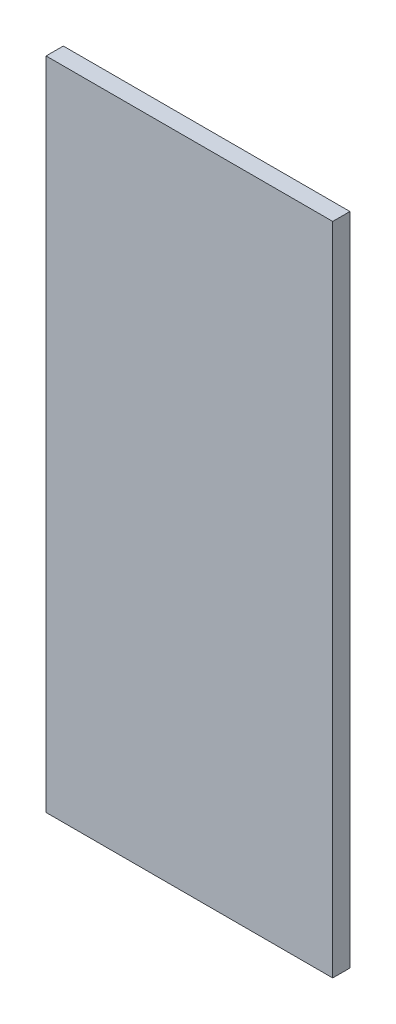
ISO-10303-21;
HEADER;
FILE_DESCRIPTION(('STEP AP214'),'2;1');
FILE_NAME('part.step','',(''),(''),'','','');
FILE_SCHEMA(('AUTOMOTIVE_DESIGN { 1 0 10303 214 1 1 1 1 }'));
ENDSEC;
DATA;
#1=APPLICATION_CONTEXT('core data for automotive mechanical design processes');
#2=APPLICATION_PROTOCOL_DEFINITION('international standard','automotive_design',2000,#1);
#3=PRODUCT_CONTEXT('',#1,'mechanical');
#4=PRODUCT('Part','Part','',(#3));
#5=PRODUCT_RELATED_PRODUCT_CATEGORY('part','',(#4));
#6=PRODUCT_DEFINITION_FORMATION('','',#4);
#7=PRODUCT_DEFINITION_CONTEXT('part definition',#1,'design');
#8=PRODUCT_DEFINITION('design','',#6,#7);
#9=PRODUCT_DEFINITION_SHAPE('','',#8);
#10=(LENGTH_UNIT() NAMED_UNIT(*) SI_UNIT(.MILLI.,.METRE.));
#11=(NAMED_UNIT(*) PLANE_ANGLE_UNIT() SI_UNIT($,.RADIAN.));
#12=(NAMED_UNIT(*) SI_UNIT($,.STERADIAN.) SOLID_ANGLE_UNIT());
#13=UNCERTAINTY_MEASURE_WITH_UNIT(LENGTH_MEASURE(1.E-05),#10,'distance_accuracy_value','');
#14=(GEOMETRIC_REPRESENTATION_CONTEXT(3) GLOBAL_UNCERTAINTY_ASSIGNED_CONTEXT((#13)) GLOBAL_UNIT_ASSIGNED_CONTEXT((#10,
#11,#12)) REPRESENTATION_CONTEXT('',''));
#15=CARTESIAN_POINT('',(0.,0.,0.));
#16=DIRECTION('',(0.,0.,1.));
#17=DIRECTION('',(1.,0.,0.));
#18=AXIS2_PLACEMENT_3D('',#15,#16,#17);
#19=CARTESIAN_POINT('',(-25.,-57.15,3.));
#20=DIRECTION('',(1.,0.,0.));
#21=DIRECTION('',(0.,0.,-1.));
#22=AXIS2_PLACEMENT_3D('',#19,#20,#21);
#23=PLANE('',#22);
#24=DIRECTION('',(0.,-1.,0.));
#25=VECTOR('',#24,1.);
#26=CARTESIAN_POINT('',(-25.,-57.15,0.));
#27=LINE('',#26,#25);
#28=CARTESIAN_POINT('',(-25.,57.15,0.));
#29=VERTEX_POINT('',#28);
#30=CARTESIAN_POINT('',(-25.,-57.15,0.));
#31=VERTEX_POINT('',#30);
#32=EDGE_CURVE('E96',#29,#31,#27,.T.);
#33=ORIENTED_EDGE('',*,*,#32,.T.);
#34=DIRECTION('',(0.,0.,-1.));
#35=VECTOR('',#34,1.);
#36=CARTESIAN_POINT('',(-25.,-57.15,3.));
#37=LINE('',#36,#35);
#38=CARTESIAN_POINT('',(-25.,-57.15,3.));
#39=VERTEX_POINT('',#38);
#40=EDGE_CURVE('E11',#39,#31,#37,.T.);
#41=ORIENTED_EDGE('',*,*,#40,.F.);
#42=DIRECTION('',(0.,-1.,0.));
#43=VECTOR('',#42,1.);
#44=CARTESIAN_POINT('',(-25.,-57.15,3.));
#45=LINE('',#44,#43);
#46=CARTESIAN_POINT('',(-25.,57.15,3.));
#47=VERTEX_POINT('',#46);
#48=EDGE_CURVE('E84',#47,#39,#45,.T.);
#49=ORIENTED_EDGE('',*,*,#48,.F.);
#50=DIRECTION('',(0.,0.,-1.));
#51=VECTOR('',#50,1.);
#52=CARTESIAN_POINT('',(-25.,57.15,3.));
#53=LINE('',#52,#51);
#54=EDGE_CURVE('E92',#47,#29,#53,.T.);
#55=ORIENTED_EDGE('',*,*,#54,.T.);
#56=EDGE_LOOP('',(#33,#41,#49,#55));
#57=FACE_BOUND('',#56,.T.);
#58=ADVANCED_FACE('F33',(#57),#23,.F.);
#59=CARTESIAN_POINT('',(25.,-57.15,3.));
#60=DIRECTION('',(0.,1.,0.));
#61=DIRECTION('',(0.,0.,1.));
#62=AXIS2_PLACEMENT_3D('',#59,#60,#61);
#63=PLANE('',#62);
#64=DIRECTION('',(1.,0.,0.));
#65=VECTOR('',#64,1.);
#66=CARTESIAN_POINT('',(25.,-57.15,0.));
#67=LINE('',#66,#65);
#68=CARTESIAN_POINT('',(25.,-57.15,0.));
#69=VERTEX_POINT('',#68);
#70=EDGE_CURVE('E88',#31,#69,#67,.T.);
#71=ORIENTED_EDGE('',*,*,#70,.T.);
#72=DIRECTION('',(0.,0.,-1.));
#73=VECTOR('',#72,1.);
#74=CARTESIAN_POINT('',(25.,-57.15,3.));
#75=LINE('',#74,#73);
#76=CARTESIAN_POINT('',(25.,-57.15,3.));
#77=VERTEX_POINT('',#76);
#78=EDGE_CURVE('E41',#77,#69,#75,.T.);
#79=ORIENTED_EDGE('',*,*,#78,.F.);
#80=DIRECTION('',(1.,0.,0.));
#81=VECTOR('',#80,1.);
#82=CARTESIAN_POINT('',(25.,-57.15,3.));
#83=LINE('',#82,#81);
#84=EDGE_CURVE('E79',#39,#77,#83,.T.);
#85=ORIENTED_EDGE('',*,*,#84,.F.);
#86=ORIENTED_EDGE('',*,*,#40,.T.);
#87=EDGE_LOOP('',(#71,#79,#85,#86));
#88=FACE_BOUND('',#87,.T.);
#89=ADVANCED_FACE('F87',(#88),#63,.F.);
#90=CARTESIAN_POINT('',(25.,-57.15,3.));
#91=DIRECTION('',(-1.,0.,0.));
#92=DIRECTION('',(0.,0.,1.));
#93=AXIS2_PLACEMENT_3D('',#90,#91,#92);
#94=PLANE('',#93);
#95=DIRECTION('',(0.,1.,0.));
#96=VECTOR('',#95,1.);
#97=CARTESIAN_POINT('',(25.,-57.15,0.));
#98=LINE('',#97,#96);
#99=CARTESIAN_POINT('',(25.,57.15,0.));
#100=VERTEX_POINT('',#99);
#101=EDGE_CURVE('E66',#69,#100,#98,.T.);
#102=ORIENTED_EDGE('',*,*,#101,.T.);
#103=DIRECTION('',(0.,0.,-1.));
#104=VECTOR('',#103,1.);
#105=CARTESIAN_POINT('',(25.,57.15,3.));
#106=LINE('',#105,#104);
#107=CARTESIAN_POINT('',(25.,57.15,3.));
#108=VERTEX_POINT('',#107);
#109=EDGE_CURVE('E89',#108,#100,#106,.T.);
#110=ORIENTED_EDGE('',*,*,#109,.F.);
#111=DIRECTION('',(0.,1.,0.));
#112=VECTOR('',#111,1.);
#113=CARTESIAN_POINT('',(25.,-57.15,3.));
#114=LINE('',#113,#112);
#115=EDGE_CURVE('E82',#77,#108,#114,.T.);
#116=ORIENTED_EDGE('',*,*,#115,.F.);
#117=ORIENTED_EDGE('',*,*,#78,.T.);
#118=EDGE_LOOP('',(#102,#110,#116,#117));
#119=FACE_BOUND('',#118,.T.);
#120=ADVANCED_FACE('F90',(#119),#94,.F.);
#121=CARTESIAN_POINT('',(25.,57.15,3.));
#122=DIRECTION('',(0.,-1.,0.));
#123=DIRECTION('',(1.,0.,0.));
#124=AXIS2_PLACEMENT_3D('',#121,#122,#123);
#125=PLANE('',#124);
#126=DIRECTION('',(-1.,0.,0.));
#127=VECTOR('',#126,1.);
#128=CARTESIAN_POINT('',(25.,57.15,0.));
#129=LINE('',#128,#127);
#130=EDGE_CURVE('E72',#100,#29,#129,.T.);
#131=ORIENTED_EDGE('',*,*,#130,.T.);
#132=ORIENTED_EDGE('',*,*,#54,.F.);
#133=DIRECTION('',(-1.,0.,0.));
#134=VECTOR('',#133,1.);
#135=CARTESIAN_POINT('',(25.,57.15,3.));
#136=LINE('',#135,#134);
#137=EDGE_CURVE('E49',#108,#47,#136,.T.);
#138=ORIENTED_EDGE('',*,*,#137,.F.);
#139=ORIENTED_EDGE('',*,*,#109,.T.);
#140=EDGE_LOOP('',(#131,#132,#138,#139));
#141=FACE_BOUND('',#140,.T.);
#142=ADVANCED_FACE('F103',(#141),#125,.F.);
#143=CARTESIAN_POINT('',(0.,0.,3.));
#144=DIRECTION('',(0.,0.,1.));
#145=DIRECTION('',(1.,0.,0.));
#146=AXIS2_PLACEMENT_3D('',#143,#144,#145);
#147=PLANE('',#146);
#148=ORIENTED_EDGE('',*,*,#48,.T.);
#149=ORIENTED_EDGE('',*,*,#84,.T.);
#150=ORIENTED_EDGE('',*,*,#115,.T.);
#151=ORIENTED_EDGE('',*,*,#137,.T.);
#152=EDGE_LOOP('',(#148,#149,#150,#151));
#153=FACE_BOUND('',#152,.T.);
#154=ADVANCED_FACE('F80',(#153),#147,.T.);
#155=CARTESIAN_POINT('',(0.,0.,0.));
#156=DIRECTION('',(0.,0.,1.));
#157=DIRECTION('',(1.,0.,0.));
#158=AXIS2_PLACEMENT_3D('',#155,#156,#157);
#159=PLANE('',#158);
#160=ORIENTED_EDGE('',*,*,#32,.F.);
#161=ORIENTED_EDGE('',*,*,#130,.F.);
#162=ORIENTED_EDGE('',*,*,#101,.F.);
#163=ORIENTED_EDGE('',*,*,#70,.F.);
#164=EDGE_LOOP('',(#160,#161,#162,#163));
#165=FACE_BOUND('',#164,.T.);
#166=ADVANCED_FACE('F106',(#165),#159,.F.);
#167=CLOSED_SHELL('',(#58,#89,#120,#142,#154,#166));
#168=MANIFOLD_SOLID_BREP('B2',#167);
#169=ADVANCED_BREP_SHAPE_REPRESENTATION('',(#18,#168),#14);
#170=SHAPE_DEFINITION_REPRESENTATION(#9,#169);
ENDSEC;
END-ISO-10303-21;
